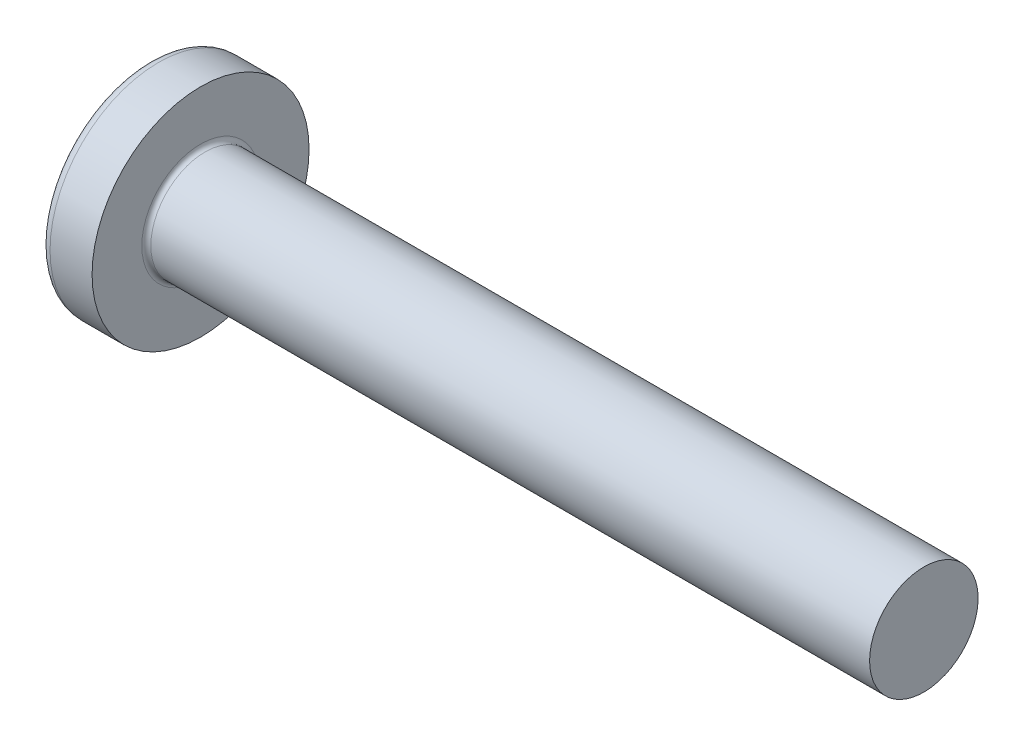
ISO-10303-21;
HEADER;
FILE_DESCRIPTION(('STEP AP214'),'2;1');
FILE_NAME('part.step','',(''),(''),'','','');
FILE_SCHEMA(('AUTOMOTIVE_DESIGN { 1 0 10303 214 1 1 1 1 }'));
ENDSEC;
DATA;
#1=APPLICATION_CONTEXT('core data for automotive mechanical design processes');
#2=APPLICATION_PROTOCOL_DEFINITION('international standard','automotive_design',2000,#1);
#3=PRODUCT_CONTEXT('',#1,'mechanical');
#4=PRODUCT('Part','Part','',(#3));
#5=PRODUCT_RELATED_PRODUCT_CATEGORY('part','',(#4));
#6=PRODUCT_DEFINITION_FORMATION('','',#4);
#7=PRODUCT_DEFINITION_CONTEXT('part definition',#1,'design');
#8=PRODUCT_DEFINITION('design','',#6,#7);
#9=PRODUCT_DEFINITION_SHAPE('','',#8);
#10=(LENGTH_UNIT() NAMED_UNIT(*) SI_UNIT(.MILLI.,.METRE.));
#11=(NAMED_UNIT(*) PLANE_ANGLE_UNIT() SI_UNIT($,.RADIAN.));
#12=(NAMED_UNIT(*) SI_UNIT($,.STERADIAN.) SOLID_ANGLE_UNIT());
#13=UNCERTAINTY_MEASURE_WITH_UNIT(LENGTH_MEASURE(1.E-05),#10,'distance_accuracy_value','');
#14=(GEOMETRIC_REPRESENTATION_CONTEXT(3) GLOBAL_UNCERTAINTY_ASSIGNED_CONTEXT((#13)) GLOBAL_UNIT_ASSIGNED_CONTEXT((#10,
#11,#12)) REPRESENTATION_CONTEXT('',''));
#15=CARTESIAN_POINT('',(0.,0.,0.));
#16=DIRECTION('',(0.,0.,1.));
#17=DIRECTION('',(1.,0.,0.));
#18=AXIS2_PLACEMENT_3D('',#15,#16,#17);
#19=CARTESIAN_POINT('',(10.,0.,0.));
#20=DIRECTION('',(-1.,0.,0.));
#21=DIRECTION('',(0.,1.,0.));
#22=AXIS2_PLACEMENT_3D('',#19,#20,#21);
#23=SPHERICAL_SURFACE('',#22,10.);
#24=CARTESIAN_POINT('',(1.83373872480847,0.,0.));
#25=DIRECTION('',(-1.,0.,0.));
#26=DIRECTION('',(0.,0.,1.));
#27=AXIS2_PLACEMENT_3D('',#24,#25,#26);
#28=CIRCLE('',#27,5.77167019027484);
#29=CARTESIAN_POINT('',(1.83373872480847,0.,5.77167019027484));
#30=VERTEX_POINT('',#29);
#31=EDGE_CURVE('E214',#30,#30,#28,.T.);
#32=ORIENTED_EDGE('',*,*,#31,.T.);
#33=EDGE_LOOP('',(#32));
#34=FACE_BOUND('',#33,.T.);
#35=CARTESIAN_POINT('',(0.11533271177369,0.,0.));
#36=DIRECTION('',(1.,0.,0.));
#37=DIRECTION('',(0.,0.,-1.));
#38=AXIS2_PLACEMENT_3D('',#35,#36,#37);
#39=CIRCLE('',#38,1.51438192047739);
#40=CARTESIAN_POINT('',(0.115332711773695,-0.709999999999995,-1.33762947076864));
#41=VERTEX_POINT('',#40);
#42=CARTESIAN_POINT('',(0.11533271177369,-1.33762947076862,-0.71));
#43=VERTEX_POINT('',#42);
#44=EDGE_CURVE('E340',#41,#43,#39,.F.);
#45=ORIENTED_EDGE('',*,*,#44,.F.);
#46=CARTESIAN_POINT('',(10.,-0.71,0.));
#47=DIRECTION('',(0.,1.,0.));
#48=DIRECTION('',(0.,0.,1.));
#49=AXIS2_PLACEMENT_3D('',#46,#47,#48);
#50=CIRCLE('',#49,9.97476315508293);
#51=CARTESIAN_POINT('',(0.516695966128057,-0.709999999999989,-3.09238493741451));
#52=VERTEX_POINT('',#51);
#53=EDGE_CURVE('E274',#52,#41,#50,.T.);
#54=ORIENTED_EDGE('',*,*,#53,.F.);
#55=CARTESIAN_POINT('',(9.3467899937754,0.,1.3101368059126));
#56=DIRECTION('',(0.446197753347436,0.,-0.894934391398443));
#57=DIRECTION('',(-0.894934391398443,0.,-0.446197753347436));
#58=AXIS2_PLACEMENT_3D('',#55,#56,#57);
#59=CIRCLE('',#58,9.89226254390578);
#60=CARTESIAN_POINT('',(0.516695966128057,0.710000000000011,-3.0923849374145));
#61=VERTEX_POINT('',#60);
#62=EDGE_CURVE('E248',#52,#61,#59,.T.);
#63=ORIENTED_EDGE('',*,*,#62,.T.);
#64=CARTESIAN_POINT('',(10.,0.71,0.));
#65=DIRECTION('',(0.,-1.,0.));
#66=DIRECTION('',(0.,0.,-1.));
#67=AXIS2_PLACEMENT_3D('',#64,#65,#66);
#68=CIRCLE('',#67,9.97476315508293);
#69=CARTESIAN_POINT('',(0.115332711773694,0.710000000000005,-1.33762947076863));
#70=VERTEX_POINT('',#69);
#71=EDGE_CURVE('E302',#70,#61,#68,.T.);
#72=ORIENTED_EDGE('',*,*,#71,.F.);
#73=CARTESIAN_POINT('',(0.11533271177369,1.33762947076862,-0.71));
#74=VERTEX_POINT('',#73);
#75=EDGE_CURVE('E355',#74,#70,#39,.F.);
#76=ORIENTED_EDGE('',*,*,#75,.F.);
#77=CARTESIAN_POINT('',(10.,0.,-0.71));
#78=DIRECTION('',(0.,0.,1.));
#79=DIRECTION('',(1.,0.,0.));
#80=AXIS2_PLACEMENT_3D('',#77,#78,#79);
#81=CIRCLE('',#80,9.97476315508293);
#82=CARTESIAN_POINT('',(0.516695966128057,3.09238493741451,-0.71));
#83=VERTEX_POINT('',#82);
#84=EDGE_CURVE('E242',#83,#74,#81,.T.);
#85=ORIENTED_EDGE('',*,*,#84,.F.);
#86=CARTESIAN_POINT('',(9.3467899937754,-1.3101368059126,0.));
#87=DIRECTION('',(0.446197753347436,0.894934391398443,0.));
#88=DIRECTION('',(-0.894934391398443,0.446197753347436,0.));
#89=AXIS2_PLACEMENT_3D('',#86,#87,#88);
#90=CIRCLE('',#89,9.89226254390578);
#91=CARTESIAN_POINT('',(0.516695966128057,3.09238493741451,0.71));
#92=VERTEX_POINT('',#91);
#93=EDGE_CURVE('E245',#83,#92,#90,.T.);
#94=ORIENTED_EDGE('',*,*,#93,.T.);
#95=CARTESIAN_POINT('',(10.,0.,0.71));
#96=DIRECTION('',(0.,0.,-1.));
#97=DIRECTION('',(0.,1.,0.));
#98=AXIS2_PLACEMENT_3D('',#95,#96,#97);
#99=CIRCLE('',#98,9.97476315508293);
#100=CARTESIAN_POINT('',(0.11533271177369,1.33762947076862,0.71));
#101=VERTEX_POINT('',#100);
#102=EDGE_CURVE('E238',#101,#92,#99,.T.);
#103=ORIENTED_EDGE('',*,*,#102,.F.);
#104=CARTESIAN_POINT('',(0.115332711773695,0.709999999999995,1.33762947076864));
#105=VERTEX_POINT('',#104);
#106=EDGE_CURVE('E354',#105,#101,#39,.F.);
#107=ORIENTED_EDGE('',*,*,#106,.F.);
#108=CARTESIAN_POINT('',(0.516695966128057,0.709999999999989,3.09238493741451));
#109=VERTEX_POINT('',#108);
#110=EDGE_CURVE('E258',#109,#105,#68,.T.);
#111=ORIENTED_EDGE('',*,*,#110,.F.);
#112=CARTESIAN_POINT('',(9.3467899937754,0.,-1.3101368059126));
#113=DIRECTION('',(0.446197753347436,0.,0.894934391398443));
#114=DIRECTION('',(0.894934391398443,0.,-0.446197753347436));
#115=AXIS2_PLACEMENT_3D('',#112,#113,#114);
#116=CIRCLE('',#115,9.89226254390578);
#117=CARTESIAN_POINT('',(0.516695966128057,-0.710000000000011,3.0923849374145));
#118=VERTEX_POINT('',#117);
#119=EDGE_CURVE('E49',#109,#118,#116,.T.);
#120=ORIENTED_EDGE('',*,*,#119,.T.);
#121=CARTESIAN_POINT('',(0.115332711773694,-0.710000000000005,1.33762947076863));
#122=VERTEX_POINT('',#121);
#123=EDGE_CURVE('E255',#122,#118,#50,.T.);
#124=ORIENTED_EDGE('',*,*,#123,.F.);
#125=CARTESIAN_POINT('',(0.11533271177369,-1.33762947076862,0.709999999999999));
#126=VERTEX_POINT('',#125);
#127=EDGE_CURVE('E386',#126,#122,#39,.F.);
#128=ORIENTED_EDGE('',*,*,#127,.F.);
#129=CARTESIAN_POINT('',(0.516695966128057,-3.0923849374145,0.709999999999999));
#130=VERTEX_POINT('',#129);
#131=EDGE_CURVE('E239',#130,#126,#99,.T.);
#132=ORIENTED_EDGE('',*,*,#131,.F.);
#133=CARTESIAN_POINT('',(9.3467899937754,1.3101368059126,0.));
#134=DIRECTION('',(0.446197753347436,-0.894934391398443,0.));
#135=DIRECTION('',(0.894934391398443,0.446197753347436,0.));
#136=AXIS2_PLACEMENT_3D('',#133,#134,#135);
#137=CIRCLE('',#136,9.89226254390578);
#138=CARTESIAN_POINT('',(0.516695966128057,-3.09238493741451,-0.71));
#139=VERTEX_POINT('',#138);
#140=EDGE_CURVE('E235',#130,#139,#137,.T.);
#141=ORIENTED_EDGE('',*,*,#140,.T.);
#142=EDGE_CURVE('E64',#43,#139,#81,.T.);
#143=ORIENTED_EDGE('',*,*,#142,.F.);
#144=EDGE_LOOP('',(#45,#54,#63,#72,#76,#85,#94,#103,#107,#111,#120,#124,#128,#132,#141,#143));
#145=FACE_BOUND('',#144,.T.);
#146=ADVANCED_FACE('F36',(#34,#145),#23,.T.);
#147=CARTESIAN_POINT('',(3.46,1.62490792462486,-0.71));
#148=DIRECTION('',(0.,0.,1.));
#149=DIRECTION('',(1.,0.,0.));
#150=AXIS2_PLACEMENT_3D('',#147,#148,#149);
#151=PLANE('',#150);
#152=ORIENTED_EDGE('',*,*,#84,.T.);
#153=CARTESIAN_POINT('',(-2.28089704213722,1.52473965101837,-0.71));
#154=CARTESIAN_POINT('',(-1.81861622822998,1.48907386498352,-0.71));
#155=CARTESIAN_POINT('',(-1.35635131302274,1.45320000395987,-0.71));
#156=CARTESIAN_POINT('',(-0.431857761667543,1.3808964085712,-0.71));
#157=CARTESIAN_POINT('',(0.0303708738054363,1.34446666558133,-0.71));
#158=CARTESIAN_POINT('',(0.954772750089382,1.27091270389059,-0.71));
#159=CARTESIAN_POINT('',(1.41694599093296,1.23378848560061,-0.71));
#160=CARTESIAN_POINT('',(2.1101468655661,1.17741958304234,-0.71));
#161=CARTESIAN_POINT('',(2.34120225142472,1.15851633138213,-0.71));
#162=CARTESIAN_POINT('',(2.80329254149198,1.12044387603508,-0.71));
#163=CARTESIAN_POINT('',(3.03432744556048,1.10127467065167,-0.71));
#164=CARTESIAN_POINT('',(3.81376951672291,1.03608826026628,-0.71));
#165=CARTESIAN_POINT('',(4.3621185642133,0.989367924506424,-0.71));
#166=CARTESIAN_POINT('',(5.18446393534975,0.917336183170652,-0.71));
#167=CARTESIAN_POINT('',(5.45854573527601,0.893000731200899,-0.71));
#168=CARTESIAN_POINT('',(6.00663594033703,0.843493254998865,-0.71));
#169=CARTESIAN_POINT('',(6.28064434495887,0.818321225066341,-0.71));
#170=CARTESIAN_POINT('',(6.82859287274618,0.766879824151132,-0.71));
#171=CARTESIAN_POINT('',(7.10253298312854,0.740610316661091,-0.71));
#172=CARTESIAN_POINT('',(7.65026285025565,0.686585019837831,-0.71));
#173=CARTESIAN_POINT('',(7.92405260972714,0.658829258423122,-0.71));
#174=CARTESIAN_POINT('',(8.33458184018721,0.615573696383427,-0.71));
#175=CARTESIAN_POINT('',(8.4714065534312,0.600884001267348,-0.71));
#176=CARTESIAN_POINT('',(8.74498055470476,0.570826220799602,-0.71));
#177=CARTESIAN_POINT('',(8.88172984329827,0.555458140591717,-0.71));
#178=CARTESIAN_POINT('',(9.15513948220117,0.523868434617907,-0.71));
#179=CARTESIAN_POINT('',(9.29179982631774,0.507646754763106,-0.71));
#180=CARTESIAN_POINT('',(9.56498051884117,0.474039680066355,-0.71));
#181=CARTESIAN_POINT('',(9.70150086350508,0.45665425489429,-0.71));
#182=CARTESIAN_POINT('',(9.83792645731126,0.438531836217977,-0.71));
#183=B_SPLINE_CURVE_WITH_KNOTS('',3,(#153,#154,#155,#156,#157,#158,#159,#160,#161,#162,#163,
#164,#165,#166,#167,#168,#169,#170,#171,#172,#173,#174,#175,#176,#177,#178,#179,#180,#181,#182),
.UNSPECIFIED.,.F.,.F.,(4,2,2,2,2,2,2,2,2,2,2,2,2,2,4),(0.,1.39096401174475,2.78194962715189,
4.17293441960638,4.86841633218882,5.56390268344286,7.21490482310267,8.04038405799492,
8.86586891866053,9.69145676295231,10.5170291044415,10.9298607906012,11.3426893470464,
11.7555440942062,12.1684096055867),.UNSPECIFIED.);
#184=CARTESIAN_POINT('',(3.46,1.06563607765503,-0.710000000000001));
#185=VERTEX_POINT('',#184);
#186=EDGE_CURVE('E375',#74,#185,#183,.T.);
#187=ORIENTED_EDGE('',*,*,#186,.T.);
#188=DIRECTION('',(0.,1.,0.));
#189=VECTOR('',#188,1.);
#190=CARTESIAN_POINT('',(3.46,-1.62490792462486,-0.71));
#191=LINE('',#190,#189);
#192=CARTESIAN_POINT('',(3.46,1.62490792462486,-0.71));
#193=VERTEX_POINT('',#192);
#194=EDGE_CURVE('E323',#185,#193,#191,.T.);
#195=ORIENTED_EDGE('',*,*,#194,.T.);
#196=DIRECTION('',(0.894934391398442,-0.446197753347436,0.));
#197=VECTOR('',#196,1.);
#198=CARTESIAN_POINT('',(0.,3.35,-0.71));
#199=LINE('',#198,#197);
#200=EDGE_CURVE('E215',#83,#193,#199,.T.);
#201=ORIENTED_EDGE('',*,*,#200,.F.);
#202=EDGE_LOOP('',(#152,#187,#195,#201));
#203=FACE_BOUND('',#202,.T.);
#204=ADVANCED_FACE('F170',(#203),#151,.T.);
#205=CARTESIAN_POINT('',(3.46,-1.62490792462486,-0.71));
#206=VERTEX_POINT('',#205);
#207=CARTESIAN_POINT('',(3.46,-1.06563607765503,-0.710000000000001));
#208=VERTEX_POINT('',#207);
#209=EDGE_CURVE('E223',#206,#208,#191,.T.);
#210=ORIENTED_EDGE('',*,*,#209,.T.);
#211=CARTESIAN_POINT('',(-2.28089704213722,-1.52473965101837,-0.71));
#212=CARTESIAN_POINT('',(-1.81861622822998,-1.48907386498352,-0.71));
#213=CARTESIAN_POINT('',(-1.35635131302274,-1.45320000395987,-0.71));
#214=CARTESIAN_POINT('',(-0.431857761667543,-1.3808964085712,-0.71));
#215=CARTESIAN_POINT('',(0.0303708738054364,-1.34446666558133,-0.71));
#216=CARTESIAN_POINT('',(0.954772750089383,-1.27091270389059,-0.71));
#217=CARTESIAN_POINT('',(1.41694599093296,-1.23378848560061,-0.71));
#218=CARTESIAN_POINT('',(2.1101468655661,-1.17741958304234,-0.71));
#219=CARTESIAN_POINT('',(2.34120225142472,-1.15851633138213,-0.71));
#220=CARTESIAN_POINT('',(2.80329254149198,-1.12044387603508,-0.71));
#221=CARTESIAN_POINT('',(3.03432744556048,-1.10127467065167,-0.71));
#222=CARTESIAN_POINT('',(3.81376951672291,-1.03608826026628,-0.71));
#223=CARTESIAN_POINT('',(4.3621185642133,-0.989367924506424,-0.71));
#224=CARTESIAN_POINT('',(5.18446393534975,-0.917336183170652,-0.71));
#225=CARTESIAN_POINT('',(5.45854573527601,-0.893000731200899,-0.71));
#226=CARTESIAN_POINT('',(6.00663594033703,-0.843493254998865,-0.71));
#227=CARTESIAN_POINT('',(6.28064434495887,-0.818321225066341,-0.71));
#228=CARTESIAN_POINT('',(6.82859287274618,-0.766879824151132,-0.71));
#229=CARTESIAN_POINT('',(7.10253298312854,-0.740610316661091,-0.71));
#230=CARTESIAN_POINT('',(7.65026285025565,-0.686585019837831,-0.71));
#231=CARTESIAN_POINT('',(7.92405260972714,-0.658829258423122,-0.71));
#232=CARTESIAN_POINT('',(8.33458184018721,-0.615573696383427,-0.71));
#233=CARTESIAN_POINT('',(8.4714065534312,-0.600884001267348,-0.71));
#234=CARTESIAN_POINT('',(8.74498055470476,-0.570826220799602,-0.71));
#235=CARTESIAN_POINT('',(8.88172984329826,-0.555458140591717,-0.71));
#236=CARTESIAN_POINT('',(9.15513948220117,-0.523868434617907,-0.71));
#237=CARTESIAN_POINT('',(9.29179982631774,-0.507646754763106,-0.71));
#238=CARTESIAN_POINT('',(9.56498051884117,-0.474039680066355,-0.71));
#239=CARTESIAN_POINT('',(9.70150086350508,-0.456654254894289,-0.71));
#240=CARTESIAN_POINT('',(9.83792645731126,-0.438531836217976,-0.71));
#241=B_SPLINE_CURVE_WITH_KNOTS('',3,(#211,#212,#213,#214,#215,#216,#217,#218,#219,#220,#221,
#222,#223,#224,#225,#226,#227,#228,#229,#230,#231,#232,#233,#234,#235,#236,#237,#238,#239,#240),
.UNSPECIFIED.,.F.,.F.,(4,2,2,2,2,2,2,2,2,2,2,2,2,2,4),(0.,1.39096401174475,2.78194962715189,
4.17293441960638,4.86841633218882,5.56390268344286,7.21490482310267,8.04038405799492,
8.86586891866053,9.69145676295231,10.5170291044415,10.9298607906012,11.3426893470464,
11.7555440942062,12.1684096055867),.UNSPECIFIED.);
#242=EDGE_CURVE('E353',#208,#43,#241,.F.);
#243=ORIENTED_EDGE('',*,*,#242,.T.);
#244=ORIENTED_EDGE('',*,*,#142,.T.);
#245=DIRECTION('',(0.894934391398442,0.446197753347436,0.));
#246=VECTOR('',#245,1.);
#247=CARTESIAN_POINT('',(0.,-3.35,-0.71));
#248=LINE('',#247,#246);
#249=EDGE_CURVE('E305',#139,#206,#248,.T.);
#250=ORIENTED_EDGE('',*,*,#249,.T.);
#251=EDGE_LOOP('',(#210,#243,#244,#250));
#252=FACE_BOUND('',#251,.T.);
#253=ADVANCED_FACE('F176',(#252),#151,.T.);
#254=CARTESIAN_POINT('',(3.46,-1.62490792462486,0.71));
#255=DIRECTION('',(0.,0.,-1.));
#256=DIRECTION('',(0.,1.,0.));
#257=AXIS2_PLACEMENT_3D('',#254,#255,#256);
#258=PLANE('',#257);
#259=DIRECTION('',(0.,-1.,0.));
#260=VECTOR('',#259,1.);
#261=CARTESIAN_POINT('',(3.46,1.62490792462486,0.71));
#262=LINE('',#261,#260);
#263=CARTESIAN_POINT('',(3.46,1.62490792462486,0.71));
#264=VERTEX_POINT('',#263);
#265=CARTESIAN_POINT('',(3.46,1.06563607765503,0.710000000000001));
#266=VERTEX_POINT('',#265);
#267=EDGE_CURVE('E313',#264,#266,#262,.T.);
#268=ORIENTED_EDGE('',*,*,#267,.T.);
#269=CARTESIAN_POINT('',(-2.28089705027091,1.52473965164577,0.71));
#270=CARTESIAN_POINT('',(-1.81861623532717,1.48907386553353,0.71));
#271=CARTESIAN_POINT('',(-1.35635131908348,1.45320000443187,0.71));
#272=CARTESIAN_POINT('',(-0.431857765655442,1.38089640888514,0.71));
#273=CARTESIAN_POINT('',(0.0303708708539246,1.3444666658152,0.71));
#274=CARTESIAN_POINT('',(0.954772749881989,1.27091270390807,0.71));
#275=CARTESIAN_POINT('',(1.41694599243322,1.23378848548075,0.71));
#276=CARTESIAN_POINT('',(2.11014686962733,1.17741958271103,0.71));
#277=CARTESIAN_POINT('',(2.3412022563395,1.15851633097942,0.71));
#278=CARTESIAN_POINT('',(2.80329254811369,1.12044387548729,0.71));
#279=CARTESIAN_POINT('',(3.03432745303557,1.10127467003019,0.71));
#280=CARTESIAN_POINT('',(3.8137695250509,1.03608825956087,0.71));
#281=CARTESIAN_POINT('',(4.36211857254078,0.989367923790553,0.71));
#282=CARTESIAN_POINT('',(5.18446394367596,0.917336182434635,0.71));
#283=CARTESIAN_POINT('',(5.45854574360168,0.893000730457427,0.71));
#284=CARTESIAN_POINT('',(6.00663594866142,0.843493254238334,0.71));
#285=CARTESIAN_POINT('',(6.28064435328252,0.818321224296205,0.71));
#286=CARTESIAN_POINT('',(6.82859288106827,0.766879823358567,0.71));
#287=CARTESIAN_POINT('',(7.1025329914498,0.7406103158557,0.71));
#288=CARTESIAN_POINT('',(7.65026285857465,0.686585019001786,0.71));
#289=CARTESIAN_POINT('',(7.92405261804469,0.658829257569248,0.71));
#290=CARTESIAN_POINT('',(8.3345818485019,0.61557369549618,0.71));
#291=CARTESIAN_POINT('',(8.47140656174489,0.600884000367865,0.71));
#292=CARTESIAN_POINT('',(8.74498056301602,0.570826219872502,0.71));
#293=CARTESIAN_POINT('',(8.8817298516081,0.555458139649238,0.71));
#294=CARTESIAN_POINT('',(9.15513949050765,0.523868433640255,0.71));
#295=CARTESIAN_POINT('',(9.29179983462227,0.50764675376566,0.71));
#296=CARTESIAN_POINT('',(9.56498052714077,0.474039679022048,0.71));
#297=CARTESIAN_POINT('',(9.70150087180168,0.456654253822914,0.71));
#298=CARTESIAN_POINT('',(9.83792646560407,0.438531835114465,0.71));
#299=B_SPLINE_CURVE_WITH_KNOTS('',3,(#269,#270,#271,#272,#273,#274,#275,#276,#277,#278,#279,
#280,#281,#282,#283,#284,#285,#286,#287,#288,#289,#290,#291,#292,#293,#294,#295,#296,#297,#298),
.UNSPECIFIED.,.F.,.F.,(4,2,2,2,2,2,2,2,2,2,2,2,2,2,4),(0.,1.39096401486289,2.78194963338846,
4.17293443098243,4.86841634613445,5.56390269995814,7.21490483961907,8.04038407451168,
8.86586893517771,9.69145677947068,10.5170291209609,10.9298608071215,11.3426893635676,
11.7555441107285,12.1684096221104),.UNSPECIFIED.);
#300=EDGE_CURVE('E279',#266,#101,#299,.F.);
#301=ORIENTED_EDGE('',*,*,#300,.T.);
#302=ORIENTED_EDGE('',*,*,#102,.T.);
#303=DIRECTION('',(0.894934391398442,-0.446197753347436,0.));
#304=VECTOR('',#303,1.);
#305=CARTESIAN_POINT('',(0.,3.35,0.71));
#306=LINE('',#305,#304);
#307=EDGE_CURVE('E220',#92,#264,#306,.T.);
#308=ORIENTED_EDGE('',*,*,#307,.T.);
#309=EDGE_LOOP('',(#268,#301,#302,#308));
#310=FACE_BOUND('',#309,.T.);
#311=ADVANCED_FACE('F371',(#310),#258,.T.);
#312=ORIENTED_EDGE('',*,*,#131,.T.);
#313=CARTESIAN_POINT('',(-2.28089704213722,-1.52473965101837,0.71));
#314=CARTESIAN_POINT('',(-1.81861622822998,-1.48907386498352,0.71));
#315=CARTESIAN_POINT('',(-1.35635131302274,-1.45320000395987,0.71));
#316=CARTESIAN_POINT('',(-0.431857761667543,-1.3808964085712,0.71));
#317=CARTESIAN_POINT('',(0.0303708738054362,-1.34446666558133,0.71));
#318=CARTESIAN_POINT('',(0.954772750089382,-1.27091270389059,0.71));
#319=CARTESIAN_POINT('',(1.41694599093296,-1.23378848560061,0.71));
#320=CARTESIAN_POINT('',(2.1101468655661,-1.17741958304234,0.71));
#321=CARTESIAN_POINT('',(2.34120225142472,-1.15851633138213,0.71));
#322=CARTESIAN_POINT('',(2.80329254149198,-1.12044387603508,0.71));
#323=CARTESIAN_POINT('',(3.03432744556048,-1.10127467065167,0.71));
#324=CARTESIAN_POINT('',(3.81376951672291,-1.03608826026628,0.71));
#325=CARTESIAN_POINT('',(4.3621185642133,-0.989367924506424,0.71));
#326=CARTESIAN_POINT('',(5.18446393534975,-0.917336183170652,0.71));
#327=CARTESIAN_POINT('',(5.45854573527601,-0.893000731200899,0.71));
#328=CARTESIAN_POINT('',(6.00663594033703,-0.843493254998865,0.71));
#329=CARTESIAN_POINT('',(6.28064434495887,-0.818321225066341,0.71));
#330=CARTESIAN_POINT('',(6.82859287274618,-0.766879824151132,0.71));
#331=CARTESIAN_POINT('',(7.10253298312854,-0.740610316661091,0.71));
#332=CARTESIAN_POINT('',(7.65026285025566,-0.686585019837831,0.71));
#333=CARTESIAN_POINT('',(7.92405260972714,-0.658829258423122,0.71));
#334=CARTESIAN_POINT('',(8.33458184018721,-0.615573696383427,0.71));
#335=CARTESIAN_POINT('',(8.4714065534312,-0.600884001267348,0.71));
#336=CARTESIAN_POINT('',(8.74498055470476,-0.570826220799602,0.71));
#337=CARTESIAN_POINT('',(8.88172984329826,-0.555458140591717,0.71));
#338=CARTESIAN_POINT('',(9.15513948220117,-0.523868434617907,0.71));
#339=CARTESIAN_POINT('',(9.29179982631774,-0.507646754763106,0.71));
#340=CARTESIAN_POINT('',(9.56498051884117,-0.474039680066355,0.71));
#341=CARTESIAN_POINT('',(9.70150086350508,-0.456654254894289,0.71));
#342=CARTESIAN_POINT('',(9.83792645731126,-0.438531836217976,0.71));
#343=B_SPLINE_CURVE_WITH_KNOTS('',3,(#313,#314,#315,#316,#317,#318,#319,#320,#321,#322,#323,
#324,#325,#326,#327,#328,#329,#330,#331,#332,#333,#334,#335,#336,#337,#338,#339,#340,#341,#342),
.UNSPECIFIED.,.F.,.F.,(4,2,2,2,2,2,2,2,2,2,2,2,2,2,4),(0.,1.39096401174475,2.78194962715189,
4.17293441960638,4.86841633218882,5.56390268344286,7.21490482310267,8.04038405799493,
8.86586891866053,9.69145676295231,10.5170291044415,10.9298607906012,11.3426893470464,
11.7555440942062,12.1684096055867),.UNSPECIFIED.);
#344=CARTESIAN_POINT('',(3.46,-1.06563607765503,0.710000000000001));
#345=VERTEX_POINT('',#344);
#346=EDGE_CURVE('E387',#126,#345,#343,.T.);
#347=ORIENTED_EDGE('',*,*,#346,.T.);
#348=CARTESIAN_POINT('',(3.46,-1.62490792462486,0.71));
#349=VERTEX_POINT('',#348);
#350=EDGE_CURVE('E315',#345,#349,#262,.T.);
#351=ORIENTED_EDGE('',*,*,#350,.T.);
#352=DIRECTION('',(0.894934391398442,0.446197753347436,0.));
#353=VECTOR('',#352,1.);
#354=CARTESIAN_POINT('',(0.,-3.35,0.709999999999999));
#355=LINE('',#354,#353);
#356=EDGE_CURVE('E307',#130,#349,#355,.T.);
#357=ORIENTED_EDGE('',*,*,#356,.F.);
#358=EDGE_LOOP('',(#312,#347,#351,#357));
#359=FACE_BOUND('',#358,.T.);
#360=ADVANCED_FACE('F416',(#359),#258,.T.);
#361=CARTESIAN_POINT('',(3.46,1.62490792462486,-0.709999999999999));
#362=DIRECTION('',(-1.,0.,0.));
#363=DIRECTION('',(0.,0.,1.));
#364=AXIS2_PLACEMENT_3D('',#361,#362,#363);
#365=PLANE('',#364);
#366=ORIENTED_EDGE('',*,*,#350,.F.);
#367=CARTESIAN_POINT('',(3.46,0.,0.));
#368=DIRECTION('',(-1.,0.,0.));
#369=DIRECTION('',(0.,0.,1.));
#370=AXIS2_PLACEMENT_3D('',#367,#368,#369);
#371=CIRCLE('',#370,1.2805);
#372=EDGE_CURVE('E348',#208,#345,#371,.T.);
#373=ORIENTED_EDGE('',*,*,#372,.F.);
#374=ORIENTED_EDGE('',*,*,#209,.F.);
#375=DIRECTION('',(0.,0.,1.));
#376=VECTOR('',#375,1.);
#377=CARTESIAN_POINT('',(3.46,-1.62490792462486,-0.71));
#378=LINE('',#377,#376);
#379=EDGE_CURVE('E310',#206,#349,#378,.T.);
#380=ORIENTED_EDGE('',*,*,#379,.T.);
#381=EDGE_LOOP('',(#366,#373,#374,#380));
#382=FACE_BOUND('',#381,.T.);
#383=ADVANCED_FACE('F409',(#382),#365,.T.);
#384=DIRECTION('',(0.,0.,-1.));
#385=VECTOR('',#384,1.);
#386=CARTESIAN_POINT('',(3.46,-0.710000000000006,1.62490792462486));
#387=LINE('',#386,#385);
#388=CARTESIAN_POINT('',(3.46,-0.709999999999996,-1.06563607765503));
#389=VERTEX_POINT('',#388);
#390=CARTESIAN_POINT('',(3.46,-0.709999999999994,-1.62490792462486));
#391=VERTEX_POINT('',#390);
#392=EDGE_CURVE('E296',#389,#391,#387,.T.);
#393=ORIENTED_EDGE('',*,*,#392,.F.);
#394=CARTESIAN_POINT('',(3.46,0.710000000000004,-1.06563607765503));
#395=VERTEX_POINT('',#394);
#396=EDGE_CURVE('E56',#395,#389,#371,.T.);
#397=ORIENTED_EDGE('',*,*,#396,.F.);
#398=DIRECTION('',(0.,0.,1.));
#399=VECTOR('',#398,1.);
#400=CARTESIAN_POINT('',(3.46,0.710000000000006,-1.62490792462486));
#401=LINE('',#400,#399);
#402=CARTESIAN_POINT('',(3.46,0.710000000000006,-1.62490792462486));
#403=VERTEX_POINT('',#402);
#404=EDGE_CURVE('E299',#403,#395,#401,.T.);
#405=ORIENTED_EDGE('',*,*,#404,.F.);
#406=DIRECTION('',(0.,-1.,0.));
#407=VECTOR('',#406,1.);
#408=CARTESIAN_POINT('',(3.46,0.710000000000006,-1.62490792462486));
#409=LINE('',#408,#407);
#410=EDGE_CURVE('E290',#403,#391,#409,.T.);
#411=ORIENTED_EDGE('',*,*,#410,.T.);
#412=EDGE_LOOP('',(#393,#397,#405,#411));
#413=FACE_BOUND('',#412,.T.);
#414=ADVANCED_FACE('F343',(#413),#365,.T.);
#415=ORIENTED_EDGE('',*,*,#194,.F.);
#416=EDGE_CURVE('E347',#266,#185,#371,.T.);
#417=ORIENTED_EDGE('',*,*,#416,.F.);
#418=ORIENTED_EDGE('',*,*,#267,.F.);
#419=DIRECTION('',(0.,0.,-1.));
#420=VECTOR('',#419,1.);
#421=CARTESIAN_POINT('',(3.46,1.62490792462486,0.71));
#422=LINE('',#421,#420);
#423=EDGE_CURVE('E316',#264,#193,#422,.T.);
#424=ORIENTED_EDGE('',*,*,#423,.T.);
#425=EDGE_LOOP('',(#415,#417,#418,#424));
#426=FACE_BOUND('',#425,.T.);
#427=ADVANCED_FACE('F410',(#426),#365,.T.);
#428=CARTESIAN_POINT('',(3.46,0.709999999999994,1.62490792462486));
#429=DIRECTION('',(0.,-1.,0.));
#430=DIRECTION('',(1.,0.,0.));
#431=AXIS2_PLACEMENT_3D('',#428,#429,#430);
#432=PLANE('',#431);
#433=ORIENTED_EDGE('',*,*,#110,.T.);
#434=CARTESIAN_POINT('',(-2.28089704213722,0.709999999999995,1.52473965101837));
#435=CARTESIAN_POINT('',(-1.81861622822998,0.709999999999995,1.48907386498352));
#436=CARTESIAN_POINT('',(-1.35635131302274,0.709999999999995,1.45320000395987));
#437=CARTESIAN_POINT('',(-0.431857761667543,0.709999999999995,1.38089640857121));
#438=CARTESIAN_POINT('',(0.0303708738054362,0.709999999999995,1.34446666558134));
#439=CARTESIAN_POINT('',(0.954772750089383,0.709999999999995,1.2709127038906));
#440=CARTESIAN_POINT('',(1.41694599093296,0.709999999999996,1.23378848560061));
#441=CARTESIAN_POINT('',(2.1101468655661,0.709999999999996,1.17741958304234));
#442=CARTESIAN_POINT('',(2.34120225142472,0.709999999999996,1.15851633138213));
#443=CARTESIAN_POINT('',(2.80329254149198,0.709999999999996,1.12044387603508));
#444=CARTESIAN_POINT('',(3.03432744556048,0.709999999999996,1.10127467065167));
#445=CARTESIAN_POINT('',(3.81376951672291,0.709999999999996,1.03608826026628));
#446=CARTESIAN_POINT('',(4.3621185642133,0.709999999999997,0.989367924506427));
#447=CARTESIAN_POINT('',(5.18446393534975,0.709999999999997,0.917336183170655));
#448=CARTESIAN_POINT('',(5.45854573527601,0.709999999999997,0.893000731200901));
#449=CARTESIAN_POINT('',(6.00663594033703,0.709999999999997,0.843493254998868));
#450=CARTESIAN_POINT('',(6.28064434495887,0.709999999999997,0.818321225066344));
#451=CARTESIAN_POINT('',(6.82859287274618,0.709999999999997,0.766879824151135));
#452=CARTESIAN_POINT('',(7.10253298312854,0.709999999999997,0.740610316661093));
#453=CARTESIAN_POINT('',(7.65026285025565,0.709999999999998,0.686585019837834));
#454=CARTESIAN_POINT('',(7.92405260972714,0.709999999999998,0.658829258423125));
#455=CARTESIAN_POINT('',(8.33458184018721,0.709999999999998,0.615573696383429));
#456=CARTESIAN_POINT('',(8.4714065534312,0.709999999999998,0.600884001267351));
#457=CARTESIAN_POINT('',(8.74498055470475,0.709999999999998,0.570826220799605));
#458=CARTESIAN_POINT('',(8.88172984329826,0.709999999999998,0.55545814059172));
#459=CARTESIAN_POINT('',(9.15513948220117,0.709999999999998,0.52386843461791));
#460=CARTESIAN_POINT('',(9.29179982631774,0.709999999999998,0.507646754763109));
#461=CARTESIAN_POINT('',(9.56498051884117,0.709999999999998,0.474039680066358));
#462=CARTESIAN_POINT('',(9.70150086350508,0.709999999999998,0.456654254894292));
#463=CARTESIAN_POINT('',(9.83792645731126,0.709999999999998,0.438531836217979));
#464=B_SPLINE_CURVE_WITH_KNOTS('',3,(#434,#435,#436,#437,#438,#439,#440,#441,#442,#443,#444,
#445,#446,#447,#448,#449,#450,#451,#452,#453,#454,#455,#456,#457,#458,#459,#460,#461,#462,#463),
.UNSPECIFIED.,.F.,.F.,(4,2,2,2,2,2,2,2,2,2,2,2,2,2,4),(0.,1.39096401174475,2.78194962715189,
4.17293441960638,4.86841633218882,5.56390268344286,7.21490482310267,8.04038405799492,
8.86586891866053,9.6914567629523,10.5170291044415,10.9298607906012,11.3426893470464,
11.7555440942062,12.1684096055867),.UNSPECIFIED.);
#465=CARTESIAN_POINT('',(3.46,0.709999999999996,1.06563607765503));
#466=VERTEX_POINT('',#465);
#467=EDGE_CURVE('E434',#105,#466,#464,.T.);
#468=ORIENTED_EDGE('',*,*,#467,.T.);
#469=CARTESIAN_POINT('',(3.46,0.709999999999994,1.62490792462486));
#470=VERTEX_POINT('',#469);
#471=EDGE_CURVE('E272',#466,#470,#401,.T.);
#472=ORIENTED_EDGE('',*,*,#471,.T.);
#473=DIRECTION('',(0.894934391398442,0.,-0.446197753347436));
#474=VECTOR('',#473,1.);
#475=CARTESIAN_POINT('',(0.,0.709999999999988,3.35));
#476=LINE('',#475,#474);
#477=EDGE_CURVE('E265',#109,#470,#476,.T.);
#478=ORIENTED_EDGE('',*,*,#477,.F.);
#479=EDGE_LOOP('',(#433,#468,#472,#478));
#480=FACE_BOUND('',#479,.T.);
#481=ADVANCED_FACE('F269',(#480),#432,.T.);
#482=CARTESIAN_POINT('',(3.46,-0.709999999999994,-1.62490792462486));
#483=DIRECTION('',(0.,1.,0.));
#484=DIRECTION('',(0.,0.,1.));
#485=AXIS2_PLACEMENT_3D('',#482,#483,#484);
#486=PLANE('',#485);
#487=CARTESIAN_POINT('',(3.46,-0.710000000000006,1.62490792462486));
#488=VERTEX_POINT('',#487);
#489=CARTESIAN_POINT('',(3.46,-0.710000000000004,1.06563607765503));
#490=VERTEX_POINT('',#489);
#491=EDGE_CURVE('E293',#488,#490,#387,.T.);
#492=ORIENTED_EDGE('',*,*,#491,.T.);
#493=CARTESIAN_POINT('',(-2.28089705027091,-0.710000000000005,1.52473965164577));
#494=CARTESIAN_POINT('',(-1.81861623532717,-0.710000000000005,1.48907386553353));
#495=CARTESIAN_POINT('',(-1.35635131908348,-0.710000000000005,1.45320000443187));
#496=CARTESIAN_POINT('',(-0.431857765655443,-0.710000000000005,1.38089640888513));
#497=CARTESIAN_POINT('',(0.030370870853924,-0.710000000000005,1.3444666658152));
#498=CARTESIAN_POINT('',(0.954772749881989,-0.710000000000004,1.27091270390807));
#499=CARTESIAN_POINT('',(1.41694599243322,-0.710000000000004,1.23378848548075));
#500=CARTESIAN_POINT('',(2.11014686962733,-0.710000000000004,1.17741958271102));
#501=CARTESIAN_POINT('',(2.3412022563395,-0.710000000000004,1.15851633097942));
#502=CARTESIAN_POINT('',(2.80329254811369,-0.710000000000004,1.12044387548729));
#503=CARTESIAN_POINT('',(3.03432745303557,-0.710000000000004,1.10127467003019));
#504=CARTESIAN_POINT('',(3.81376952505089,-0.710000000000004,1.03608825956087));
#505=CARTESIAN_POINT('',(4.36211857254078,-0.710000000000004,0.989367923790551));
#506=CARTESIAN_POINT('',(5.18446394367596,-0.710000000000003,0.917336182434633));
#507=CARTESIAN_POINT('',(5.45854574360167,-0.710000000000003,0.893000730457425));
#508=CARTESIAN_POINT('',(6.00663594866141,-0.710000000000003,0.843493254238332));
#509=CARTESIAN_POINT('',(6.28064435328251,-0.710000000000003,0.818321224296203));
#510=CARTESIAN_POINT('',(6.82859288106826,-0.710000000000003,0.766879823358565));
#511=CARTESIAN_POINT('',(7.1025329914498,-0.710000000000003,0.740610315855698));
#512=CARTESIAN_POINT('',(7.65026285857464,-0.710000000000003,0.686585019001784));
#513=CARTESIAN_POINT('',(7.92405261804469,-0.710000000000003,0.658829257569246));
#514=CARTESIAN_POINT('',(8.33458184850189,-0.710000000000002,0.615573695496179));
#515=CARTESIAN_POINT('',(8.47140656174489,-0.710000000000002,0.600884000367863));
#516=CARTESIAN_POINT('',(8.74498056301602,-0.710000000000002,0.5708262198725));
#517=CARTESIAN_POINT('',(8.8817298516081,-0.710000000000002,0.555458139649236));
#518=CARTESIAN_POINT('',(9.15513949050764,-0.710000000000002,0.523868433640253));
#519=CARTESIAN_POINT('',(9.29179983462226,-0.710000000000002,0.507646753765658));
#520=CARTESIAN_POINT('',(9.56498052714076,-0.710000000000002,0.474039679022046));
#521=CARTESIAN_POINT('',(9.70150087180168,-0.710000000000002,0.456654253822912));
#522=CARTESIAN_POINT('',(9.83792646560407,-0.710000000000002,0.438531835114463));
#523=B_SPLINE_CURVE_WITH_KNOTS('',3,(#493,#494,#495,#496,#497,#498,#499,#500,#501,#502,#503,
#504,#505,#506,#507,#508,#509,#510,#511,#512,#513,#514,#515,#516,#517,#518,#519,#520,#521,#522),
.UNSPECIFIED.,.F.,.F.,(4,2,2,2,2,2,2,2,2,2,2,2,2,2,4),(0.,1.39096401486289,2.78194963338846,
4.17293443098243,4.86841634613445,5.56390269995814,7.21490483961907,8.04038407451168,
8.8658689351777,9.69145677947067,10.5170291209609,10.9298608071215,11.3426893635676,
11.7555441107285,12.1684096221104),.UNSPECIFIED.);
#524=EDGE_CURVE('E380',#490,#122,#523,.F.);
#525=ORIENTED_EDGE('',*,*,#524,.T.);
#526=ORIENTED_EDGE('',*,*,#123,.T.);
#527=DIRECTION('',(0.894934391398442,0.,-0.446197753347436));
#528=VECTOR('',#527,1.);
#529=CARTESIAN_POINT('',(0.,-0.710000000000012,3.35));
#530=LINE('',#529,#528);
#531=EDGE_CURVE('E267',#118,#488,#530,.T.);
#532=ORIENTED_EDGE('',*,*,#531,.T.);
#533=EDGE_LOOP('',(#492,#525,#526,#532));
#534=FACE_BOUND('',#533,.T.);
#535=ADVANCED_FACE('F205',(#534),#486,.T.);
#536=ORIENTED_EDGE('',*,*,#404,.T.);
#537=CARTESIAN_POINT('',(-2.28089704213722,0.710000000000005,-1.52473965101837));
#538=CARTESIAN_POINT('',(-1.81861622822998,0.710000000000005,-1.48907386498351));
#539=CARTESIAN_POINT('',(-1.35635131302274,0.710000000000005,-1.45320000395987));
#540=CARTESIAN_POINT('',(-0.431857761667543,0.710000000000005,-1.3808964085712));
#541=CARTESIAN_POINT('',(0.0303708738054363,0.710000000000005,-1.34446666558133));
#542=CARTESIAN_POINT('',(0.954772750089382,0.710000000000004,-1.27091270389059));
#543=CARTESIAN_POINT('',(1.41694599093296,0.710000000000004,-1.23378848560061));
#544=CARTESIAN_POINT('',(2.1101468655661,0.710000000000004,-1.17741958304234));
#545=CARTESIAN_POINT('',(2.34120225142472,0.710000000000004,-1.15851633138212));
#546=CARTESIAN_POINT('',(2.80329254149198,0.710000000000004,-1.12044387603508));
#547=CARTESIAN_POINT('',(3.03432744556048,0.710000000000004,-1.10127467065166));
#548=CARTESIAN_POINT('',(3.81376951672291,0.710000000000004,-1.03608826026627));
#549=CARTESIAN_POINT('',(4.3621185642133,0.710000000000004,-0.989367924506422));
#550=CARTESIAN_POINT('',(5.18446393534975,0.710000000000003,-0.91733618317065));
#551=CARTESIAN_POINT('',(5.45854573527601,0.710000000000003,-0.893000731200896));
#552=CARTESIAN_POINT('',(6.00663594033703,0.710000000000003,-0.843493254998863));
#553=CARTESIAN_POINT('',(6.28064434495887,0.710000000000003,-0.818321225066339));
#554=CARTESIAN_POINT('',(6.82859287274618,0.710000000000003,-0.76687982415113));
#555=CARTESIAN_POINT('',(7.10253298312854,0.710000000000003,-0.740610316661088));
#556=CARTESIAN_POINT('',(7.65026285025565,0.710000000000002,-0.686585019837829));
#557=CARTESIAN_POINT('',(7.92405260972714,0.710000000000002,-0.65882925842312));
#558=CARTESIAN_POINT('',(8.33458184018721,0.710000000000002,-0.615573696383424));
#559=CARTESIAN_POINT('',(8.4714065534312,0.710000000000002,-0.600884001267345));
#560=CARTESIAN_POINT('',(8.74498055470476,0.710000000000002,-0.5708262207996));
#561=CARTESIAN_POINT('',(8.88172984329827,0.710000000000002,-0.555458140591715));
#562=CARTESIAN_POINT('',(9.15513948220117,0.710000000000002,-0.523868434617905));
#563=CARTESIAN_POINT('',(9.29179982631774,0.710000000000002,-0.507646754763103));
#564=CARTESIAN_POINT('',(9.56498051884117,0.710000000000002,-0.474039680066353));
#565=CARTESIAN_POINT('',(9.70150086350508,0.710000000000001,-0.456654254894287));
#566=CARTESIAN_POINT('',(9.83792645731126,0.710000000000001,-0.438531836217974));
#567=B_SPLINE_CURVE_WITH_KNOTS('',3,(#537,#538,#539,#540,#541,#542,#543,#544,#545,#546,#547,
#548,#549,#550,#551,#552,#553,#554,#555,#556,#557,#558,#559,#560,#561,#562,#563,#564,#565,#566),
.UNSPECIFIED.,.F.,.F.,(4,2,2,2,2,2,2,2,2,2,2,2,2,2,4),(0.,1.39096401174475,2.78194962715189,
4.17293441960638,4.86841633218882,5.56390268344286,7.21490482310267,8.04038405799492,
8.86586891866053,9.69145676295231,10.5170291044415,10.9298607906012,11.3426893470464,
11.7555440942062,12.1684096055867),.UNSPECIFIED.);
#568=EDGE_CURVE('E332',#395,#70,#567,.F.);
#569=ORIENTED_EDGE('',*,*,#568,.T.);
#570=ORIENTED_EDGE('',*,*,#71,.T.);
#571=DIRECTION('',(0.894934391398442,0.,0.446197753347436));
#572=VECTOR('',#571,1.);
#573=CARTESIAN_POINT('',(0.,0.710000000000012,-3.35));
#574=LINE('',#573,#572);
#575=EDGE_CURVE('E276',#61,#403,#574,.T.);
#576=ORIENTED_EDGE('',*,*,#575,.T.);
#577=EDGE_LOOP('',(#536,#569,#570,#576));
#578=FACE_BOUND('',#577,.T.);
#579=ADVANCED_FACE('F203',(#578),#432,.T.);
#580=ORIENTED_EDGE('',*,*,#53,.T.);
#581=CARTESIAN_POINT('',(-2.28089704213722,-0.709999999999994,-1.52473965101837));
#582=CARTESIAN_POINT('',(-1.81861622822998,-0.709999999999994,-1.48907386498352));
#583=CARTESIAN_POINT('',(-1.35635131302274,-0.709999999999995,-1.45320000395987));
#584=CARTESIAN_POINT('',(-0.431857761667543,-0.709999999999995,-1.38089640857121));
#585=CARTESIAN_POINT('',(0.0303708738054366,-0.709999999999995,-1.34446666558134));
#586=CARTESIAN_POINT('',(0.954772750089383,-0.709999999999995,-1.2709127038906));
#587=CARTESIAN_POINT('',(1.41694599093296,-0.709999999999995,-1.23378848560061));
#588=CARTESIAN_POINT('',(2.1101468655661,-0.709999999999996,-1.17741958304234));
#589=CARTESIAN_POINT('',(2.34120225142472,-0.709999999999996,-1.15851633138213));
#590=CARTESIAN_POINT('',(2.80329254149198,-0.709999999999996,-1.12044387603508));
#591=CARTESIAN_POINT('',(3.03432744556048,-0.709999999999996,-1.10127467065167));
#592=CARTESIAN_POINT('',(3.81376951672291,-0.709999999999996,-1.03608826026628));
#593=CARTESIAN_POINT('',(4.3621185642133,-0.709999999999996,-0.989367924506427));
#594=CARTESIAN_POINT('',(5.18446393534975,-0.709999999999997,-0.917336183170655));
#595=CARTESIAN_POINT('',(5.458545735276,-0.709999999999997,-0.893000731200901));
#596=CARTESIAN_POINT('',(6.00663594033703,-0.709999999999997,-0.843493254998868));
#597=CARTESIAN_POINT('',(6.28064434495887,-0.709999999999997,-0.818321225066344));
#598=CARTESIAN_POINT('',(6.82859287274618,-0.709999999999997,-0.766879824151135));
#599=CARTESIAN_POINT('',(7.10253298312854,-0.709999999999997,-0.740610316661094));
#600=CARTESIAN_POINT('',(7.65026285025565,-0.709999999999998,-0.686585019837834));
#601=CARTESIAN_POINT('',(7.92405260972714,-0.709999999999998,-0.658829258423125));
#602=CARTESIAN_POINT('',(8.33458184018721,-0.709999999999998,-0.615573696383429));
#603=CARTESIAN_POINT('',(8.4714065534312,-0.709999999999998,-0.60088400126735));
#604=CARTESIAN_POINT('',(8.74498055470476,-0.709999999999998,-0.570826220799605));
#605=CARTESIAN_POINT('',(8.88172984329826,-0.709999999999998,-0.55545814059172));
#606=CARTESIAN_POINT('',(9.15513948220117,-0.709999999999998,-0.52386843461791));
#607=CARTESIAN_POINT('',(9.29179982631774,-0.709999999999998,-0.507646754763108));
#608=CARTESIAN_POINT('',(9.56498051884117,-0.709999999999999,-0.474039680066358));
#609=CARTESIAN_POINT('',(9.70150086350508,-0.709999999999999,-0.456654254894292));
#610=CARTESIAN_POINT('',(9.83792645731126,-0.709999999999999,-0.438531836217979));
#611=B_SPLINE_CURVE_WITH_KNOTS('',3,(#581,#582,#583,#584,#585,#586,#587,#588,#589,#590,#591,
#592,#593,#594,#595,#596,#597,#598,#599,#600,#601,#602,#603,#604,#605,#606,#607,#608,#609,#610),
.UNSPECIFIED.,.F.,.F.,(4,2,2,2,2,2,2,2,2,2,2,2,2,2,4),(0.,1.39096401174475,2.78194962715189,
4.17293441960638,4.86841633218882,5.56390268344286,7.21490482310267,8.04038405799492,
8.86586891866052,9.6914567629523,10.5170291044415,10.9298607906012,11.3426893470464,
11.7555440942062,12.1684096055867),.UNSPECIFIED.);
#612=EDGE_CURVE('E11',#41,#389,#611,.T.);
#613=ORIENTED_EDGE('',*,*,#612,.T.);
#614=ORIENTED_EDGE('',*,*,#392,.T.);
#615=DIRECTION('',(0.894934391398442,0.,0.446197753347436));
#616=VECTOR('',#615,1.);
#617=CARTESIAN_POINT('',(0.,-0.709999999999988,-3.35));
#618=LINE('',#617,#616);
#619=EDGE_CURVE('E287',#52,#391,#618,.T.);
#620=ORIENTED_EDGE('',*,*,#619,.F.);
#621=EDGE_LOOP('',(#580,#613,#614,#620));
#622=FACE_BOUND('',#621,.T.);
#623=ADVANCED_FACE('F198',(#622),#486,.T.);
#624=CARTESIAN_POINT('',(-25.4,0.,0.));
#625=DIRECTION('',(-1.,0.,0.));
#626=DIRECTION('',(0.,0.,1.));
#627=AXIS2_PLACEMENT_3D('',#624,#625,#626);
#628=CYLINDRICAL_SURFACE('',#627,3.);
#629=CARTESIAN_POINT('',(4.85,0.,0.));
#630=DIRECTION('',(-1.,0.,0.));
#631=DIRECTION('',(0.,0.,1.));
#632=AXIS2_PLACEMENT_3D('',#629,#630,#631);
#633=CIRCLE('',#632,3.);
#634=CARTESIAN_POINT('',(4.85,0.,3.));
#635=VERTEX_POINT('',#634);
#636=EDGE_CURVE('E209',#635,#635,#633,.F.);
#637=ORIENTED_EDGE('',*,*,#636,.T.);
#638=EDGE_LOOP('',(#637));
#639=FACE_BOUND('',#638,.T.);
#640=CARTESIAN_POINT('',(44.6,0.,0.));
#641=DIRECTION('',(-1.,0.,0.));
#642=DIRECTION('',(0.,0.,1.));
#643=AXIS2_PLACEMENT_3D('',#640,#641,#642);
#644=CIRCLE('',#643,3.);
#645=CARTESIAN_POINT('',(44.6,0.,3.));
#646=VERTEX_POINT('',#645);
#647=EDGE_CURVE('E212',#646,#646,#644,.T.);
#648=ORIENTED_EDGE('',*,*,#647,.T.);
#649=EDGE_LOOP('',(#648));
#650=FACE_BOUND('',#649,.T.);
#651=ADVANCED_FACE('F195',(#639,#650),#628,.T.);
#652=CARTESIAN_POINT('',(4.6,3.,0.));
#653=DIRECTION('',(-1.,0.,0.));
#654=DIRECTION('',(0.,0.,1.));
#655=AXIS2_PLACEMENT_3D('',#652,#653,#654);
#656=PLANE('',#655);
#657=CARTESIAN_POINT('',(4.6,0.,0.));
#658=DIRECTION('',(-1.,0.,0.));
#659=DIRECTION('',(0.,0.,1.));
#660=AXIS2_PLACEMENT_3D('',#657,#658,#659);
#661=CIRCLE('',#660,3.25);
#662=CARTESIAN_POINT('',(4.6,0.,3.25));
#663=VERTEX_POINT('',#662);
#664=EDGE_CURVE('E231',#663,#663,#661,.T.);
#665=ORIENTED_EDGE('',*,*,#664,.T.);
#666=EDGE_LOOP('',(#665));
#667=FACE_BOUND('',#666,.T.);
#668=CARTESIAN_POINT('',(4.6,0.,0.));
#669=DIRECTION('',(-1.,0.,0.));
#670=DIRECTION('',(0.,0.,1.));
#671=AXIS2_PLACEMENT_3D('',#668,#669,#670);
#672=CIRCLE('',#671,6.);
#673=CARTESIAN_POINT('',(4.6,0.,6.));
#674=VERTEX_POINT('',#673);
#675=EDGE_CURVE('E228',#674,#674,#672,.T.);
#676=ORIENTED_EDGE('',*,*,#675,.F.);
#677=EDGE_LOOP('',(#676));
#678=FACE_BOUND('',#677,.T.);
#679=ADVANCED_FACE('F192',(#667,#678),#656,.F.);
#680=CARTESIAN_POINT('',(-25.4,0.,0.));
#681=DIRECTION('',(-1.,0.,0.));
#682=DIRECTION('',(0.,0.,1.));
#683=AXIS2_PLACEMENT_3D('',#680,#681,#682);
#684=CYLINDRICAL_SURFACE('',#683,6.);
#685=ORIENTED_EDGE('',*,*,#675,.T.);
#686=EDGE_LOOP('',(#685));
#687=FACE_BOUND('',#686,.T.);
#688=CARTESIAN_POINT('',(2.27471683366881,0.,0.));
#689=DIRECTION('',(-1.,0.,0.));
#690=DIRECTION('',(0.,0.,1.));
#691=AXIS2_PLACEMENT_3D('',#688,#689,#690);
#692=CIRCLE('',#691,6.);
#693=CARTESIAN_POINT('',(2.27471683366881,0.,6.));
#694=VERTEX_POINT('',#693);
#695=EDGE_CURVE('E217',#694,#694,#692,.T.);
#696=ORIENTED_EDGE('',*,*,#695,.F.);
#697=EDGE_LOOP('',(#696));
#698=FACE_BOUND('',#697,.T.);
#699=ADVANCED_FACE('F188',(#687,#698),#684,.T.);
#700=CARTESIAN_POINT('',(2.27471683366881,0.,0.));
#701=DIRECTION('',(-1.,0.,0.));
#702=DIRECTION('',(0.,0.,1.));
#703=AXIS2_PLACEMENT_3D('',#700,#701,#702);
#704=TOROIDAL_SURFACE('',#703,5.46,0.54);
#705=ORIENTED_EDGE('',*,*,#695,.T.);
#706=EDGE_LOOP('',(#705));
#707=FACE_BOUND('',#706,.T.);
#708=ORIENTED_EDGE('',*,*,#31,.F.);
#709=EDGE_LOOP('',(#708));
#710=FACE_BOUND('',#709,.T.);
#711=ADVANCED_FACE('F185',(#707,#710),#704,.T.);
#712=CARTESIAN_POINT('',(44.6,3.,0.));
#713=DIRECTION('',(1.,0.,0.));
#714=DIRECTION('',(0.,0.,-1.));
#715=AXIS2_PLACEMENT_3D('',#712,#713,#714);
#716=PLANE('',#715);
#717=ORIENTED_EDGE('',*,*,#647,.F.);
#718=EDGE_LOOP('',(#717));
#719=FACE_BOUND('',#718,.T.);
#720=ADVANCED_FACE('F183',(#719),#716,.T.);
#721=CARTESIAN_POINT('',(4.85,0.,0.));
#722=DIRECTION('',(-1.,0.,0.));
#723=DIRECTION('',(0.,0.,1.));
#724=AXIS2_PLACEMENT_3D('',#721,#722,#723);
#725=TOROIDAL_SURFACE('',#724,3.25,0.25);
#726=ORIENTED_EDGE('',*,*,#636,.F.);
#727=EDGE_LOOP('',(#726));
#728=FACE_BOUND('',#727,.T.);
#729=ORIENTED_EDGE('',*,*,#664,.F.);
#730=EDGE_LOOP('',(#729));
#731=FACE_BOUND('',#730,.T.);
#732=ADVANCED_FACE('F38',(#728,#731),#725,.F.);
#733=CARTESIAN_POINT('',(3.46,1.62490792462486,0.71));
#734=DIRECTION('',(0.446197753347436,0.894934391398443,0.));
#735=DIRECTION('',(-0.894934391398443,0.446197753347436,0.));
#736=AXIS2_PLACEMENT_3D('',#733,#734,#735);
#737=PLANE('',#736);
#738=ORIENTED_EDGE('',*,*,#200,.T.);
#739=ORIENTED_EDGE('',*,*,#423,.F.);
#740=ORIENTED_EDGE('',*,*,#307,.F.);
#741=ORIENTED_EDGE('',*,*,#93,.F.);
#742=EDGE_LOOP('',(#738,#739,#740,#741));
#743=FACE_BOUND('',#742,.T.);
#744=ADVANCED_FACE('F369',(#743),#737,.F.);
#745=CARTESIAN_POINT('',(0.,-3.35,-0.71));
#746=DIRECTION('',(0.446197753347436,-0.894934391398443,0.));
#747=DIRECTION('',(0.894934391398443,0.446197753347436,0.));
#748=AXIS2_PLACEMENT_3D('',#745,#746,#747);
#749=PLANE('',#748);
#750=ORIENTED_EDGE('',*,*,#356,.T.);
#751=ORIENTED_EDGE('',*,*,#379,.F.);
#752=ORIENTED_EDGE('',*,*,#249,.F.);
#753=ORIENTED_EDGE('',*,*,#140,.F.);
#754=EDGE_LOOP('',(#750,#751,#752,#753));
#755=FACE_BOUND('',#754,.T.);
#756=ADVANCED_FACE('F407',(#755),#749,.F.);
#757=ORIENTED_EDGE('',*,*,#471,.F.);
#758=EDGE_CURVE('E351',#490,#466,#371,.T.);
#759=ORIENTED_EDGE('',*,*,#758,.F.);
#760=ORIENTED_EDGE('',*,*,#491,.F.);
#761=DIRECTION('',(0.,1.,0.));
#762=VECTOR('',#761,1.);
#763=CARTESIAN_POINT('',(3.46,-0.710000000000006,1.62490792462486));
#764=LINE('',#763,#762);
#765=EDGE_CURVE('E297',#488,#470,#764,.T.);
#766=ORIENTED_EDGE('',*,*,#765,.T.);
#767=EDGE_LOOP('',(#757,#759,#760,#766));
#768=FACE_BOUND('',#767,.T.);
#769=ADVANCED_FACE('F403',(#768),#365,.T.);
#770=CARTESIAN_POINT('',(3.46,-0.710000000000006,1.62490792462486));
#771=DIRECTION('',(0.446197753347436,0.,0.894934391398443));
#772=DIRECTION('',(-0.894934391398443,0.,0.446197753347436));
#773=AXIS2_PLACEMENT_3D('',#770,#771,#772);
#774=PLANE('',#773);
#775=ORIENTED_EDGE('',*,*,#477,.T.);
#776=ORIENTED_EDGE('',*,*,#765,.F.);
#777=ORIENTED_EDGE('',*,*,#531,.F.);
#778=ORIENTED_EDGE('',*,*,#119,.F.);
#779=EDGE_LOOP('',(#775,#776,#777,#778));
#780=FACE_BOUND('',#779,.T.);
#781=ADVANCED_FACE('F263',(#780),#774,.F.);
#782=CARTESIAN_POINT('',(0.,0.710000000000012,-3.35));
#783=DIRECTION('',(0.446197753347436,0.,-0.894934391398443));
#784=DIRECTION('',(0.894934391398443,0.,0.446197753347436));
#785=AXIS2_PLACEMENT_3D('',#782,#783,#784);
#786=PLANE('',#785);
#787=ORIENTED_EDGE('',*,*,#619,.T.);
#788=ORIENTED_EDGE('',*,*,#410,.F.);
#789=ORIENTED_EDGE('',*,*,#575,.F.);
#790=ORIENTED_EDGE('',*,*,#62,.F.);
#791=EDGE_LOOP('',(#787,#788,#789,#790));
#792=FACE_BOUND('',#791,.T.);
#793=ADVANCED_FACE('F335',(#792),#786,.F.);
#794=CARTESIAN_POINT('',(3.46,0.,0.));
#795=DIRECTION('',(-1.,0.,0.));
#796=DIRECTION('',(0.,0.,1.));
#797=AXIS2_PLACEMENT_3D('',#794,#795,#796);
#798=CONICAL_SURFACE('',#797,1.2805,0.0698131700797659);
#799=EDGE_CURVE('E349',#466,#266,#371,.T.);
#800=ORIENTED_EDGE('',*,*,#799,.F.);
#801=ORIENTED_EDGE('',*,*,#467,.F.);
#802=ORIENTED_EDGE('',*,*,#106,.T.);
#803=ORIENTED_EDGE('',*,*,#300,.F.);
#804=EDGE_LOOP('',(#800,#801,#802,#803));
#805=FACE_BOUND('',#804,.T.);
#806=ADVANCED_FACE('F167',(#805),#798,.F.);
#807=ORIENTED_EDGE('',*,*,#127,.T.);
#808=ORIENTED_EDGE('',*,*,#524,.F.);
#809=EDGE_CURVE('E442',#345,#490,#371,.T.);
#810=ORIENTED_EDGE('',*,*,#809,.F.);
#811=ORIENTED_EDGE('',*,*,#346,.F.);
#812=EDGE_LOOP('',(#807,#808,#810,#811));
#813=FACE_BOUND('',#812,.T.);
#814=ADVANCED_FACE('F401',(#813),#798,.F.);
#815=ORIENTED_EDGE('',*,*,#75,.T.);
#816=ORIENTED_EDGE('',*,*,#568,.F.);
#817=EDGE_CURVE('E344',#185,#395,#371,.T.);
#818=ORIENTED_EDGE('',*,*,#817,.F.);
#819=ORIENTED_EDGE('',*,*,#186,.F.);
#820=EDGE_LOOP('',(#815,#816,#818,#819));
#821=FACE_BOUND('',#820,.T.);
#822=ADVANCED_FACE('F165',(#821),#798,.F.);
#823=EDGE_CURVE('E345',#389,#208,#371,.T.);
#824=ORIENTED_EDGE('',*,*,#823,.F.);
#825=ORIENTED_EDGE('',*,*,#612,.F.);
#826=ORIENTED_EDGE('',*,*,#44,.T.);
#827=ORIENTED_EDGE('',*,*,#242,.F.);
#828=EDGE_LOOP('',(#824,#825,#826,#827));
#829=FACE_BOUND('',#828,.T.);
#830=ADVANCED_FACE('F160',(#829),#798,.F.);
#831=CARTESIAN_POINT('',(3.87605967102623,0.,0.));
#832=DIRECTION('',(-1.,0.,0.));
#833=DIRECTION('',(0.,0.,1.));
#834=AXIS2_PLACEMENT_3D('',#831,#832,#833);
#835=CONICAL_SURFACE('',#834,0.,1.25663706143592);
#836=ORIENTED_EDGE('',*,*,#799,.T.);
#837=ORIENTED_EDGE('',*,*,#416,.T.);
#838=ORIENTED_EDGE('',*,*,#817,.T.);
#839=ORIENTED_EDGE('',*,*,#396,.T.);
#840=ORIENTED_EDGE('',*,*,#823,.T.);
#841=ORIENTED_EDGE('',*,*,#372,.T.);
#842=ORIENTED_EDGE('',*,*,#809,.T.);
#843=ORIENTED_EDGE('',*,*,#758,.T.);
#844=EDGE_LOOP('',(#836,#837,#838,#839,#840,#841,#842,#843));
#845=FACE_BOUND('',#844,.T.);
#846=CARTESIAN_POINT('',(3.87605967102623,0.,0.));
#847=VERTEX_POINT('',#846);
#848=VERTEX_LOOP('',#847);
#849=FACE_BOUND('',#848,.T.);
#850=ADVANCED_FACE('F158',(#845,#849),#835,.F.);
#851=CLOSED_SHELL('',(#146,#204,#253,#311,#360,#383,#414,#427,#481,#535,#579,#623,#651,#679,
#699,#711,#720,#732,#744,#756,#769,#781,#793,#806,#814,#822,#830,#850));
#852=MANIFOLD_SOLID_BREP('B2',#851);
#853=ADVANCED_BREP_SHAPE_REPRESENTATION('',(#18,#852),#14);
#854=SHAPE_DEFINITION_REPRESENTATION(#9,#853);
ENDSEC;
END-ISO-10303-21;
